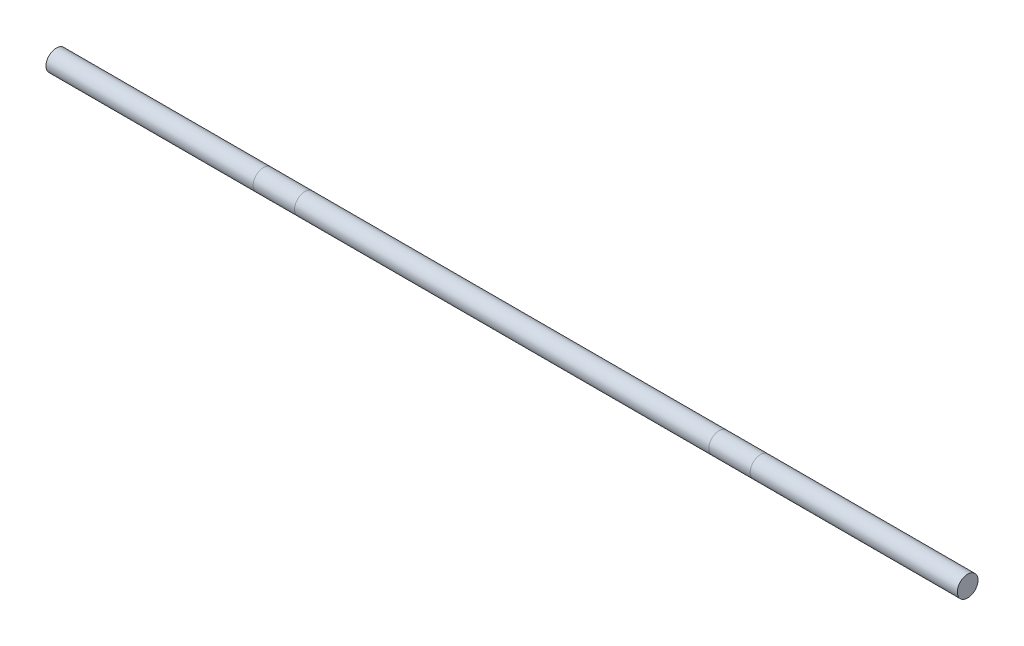
ISO-10303-21;
HEADER;
FILE_DESCRIPTION(('STEP AP214'),'2;1');
FILE_NAME('part.step','',(''),(''),'','','');
FILE_SCHEMA(('AUTOMOTIVE_DESIGN { 1 0 10303 214 1 1 1 1 }'));
ENDSEC;
DATA;
#1=APPLICATION_CONTEXT('core data for automotive mechanical design processes');
#2=APPLICATION_PROTOCOL_DEFINITION('international standard','automotive_design',2000,#1);
#3=PRODUCT_CONTEXT('',#1,'mechanical');
#4=PRODUCT('Part','Part','',(#3));
#5=PRODUCT_RELATED_PRODUCT_CATEGORY('part','',(#4));
#6=PRODUCT_DEFINITION_FORMATION('','',#4);
#7=PRODUCT_DEFINITION_CONTEXT('part definition',#1,'design');
#8=PRODUCT_DEFINITION('design','',#6,#7);
#9=PRODUCT_DEFINITION_SHAPE('','',#8);
#10=(LENGTH_UNIT() NAMED_UNIT(*) SI_UNIT(.MILLI.,.METRE.));
#11=(NAMED_UNIT(*) PLANE_ANGLE_UNIT() SI_UNIT($,.RADIAN.));
#12=(NAMED_UNIT(*) SI_UNIT($,.STERADIAN.) SOLID_ANGLE_UNIT());
#13=UNCERTAINTY_MEASURE_WITH_UNIT(LENGTH_MEASURE(1.E-05),#10,'distance_accuracy_value','');
#14=(GEOMETRIC_REPRESENTATION_CONTEXT(3) GLOBAL_UNCERTAINTY_ASSIGNED_CONTEXT((#13)) GLOBAL_UNIT_ASSIGNED_CONTEXT((#10,
#11,#12)) REPRESENTATION_CONTEXT('',''));
#15=CARTESIAN_POINT('',(0.,0.,0.));
#16=DIRECTION('',(0.,0.,1.));
#17=DIRECTION('',(1.,0.,0.));
#18=AXIS2_PLACEMENT_3D('',#15,#16,#17);
#19=CARTESIAN_POINT('',(1100.,0.,0.));
#20=DIRECTION('',(-1.,0.,0.));
#21=DIRECTION('',(0.,0.,1.));
#22=AXIS2_PLACEMENT_3D('',#19,#20,#21);
#23=CYLINDRICAL_SURFACE('',#22,25.);
#24=CARTESIAN_POINT('',(-500.,0.,0.));
#25=DIRECTION('',(-1.,0.,0.));
#26=DIRECTION('',(0.,-1.,0.));
#27=AXIS2_PLACEMENT_3D('',#24,#25,#26);
#28=CIRCLE('',#27,25.);
#29=CARTESIAN_POINT('',(-500.,-25.,0.));
#30=VERTEX_POINT('',#29);
#31=EDGE_CURVE('E63',#30,#30,#28,.T.);
#32=ORIENTED_EDGE('',*,*,#31,.F.);
#33=EDGE_LOOP('',(#32));
#34=FACE_BOUND('',#33,.T.);
#35=CARTESIAN_POINT('',(500.,0.,0.));
#36=DIRECTION('',(1.,0.,0.));
#37=DIRECTION('',(0.,1.,0.));
#38=AXIS2_PLACEMENT_3D('',#35,#36,#37);
#39=CIRCLE('',#38,25.);
#40=CARTESIAN_POINT('',(500.,25.,0.));
#41=VERTEX_POINT('',#40);
#42=EDGE_CURVE('E10',#41,#41,#39,.T.);
#43=ORIENTED_EDGE('',*,*,#42,.F.);
#44=EDGE_LOOP('',(#43));
#45=FACE_BOUND('',#44,.T.);
#46=ADVANCED_FACE('F40',(#34,#45),#23,.T.);
#47=CARTESIAN_POINT('',(1100.,0.,0.));
#48=DIRECTION('',(1.,0.,0.));
#49=DIRECTION('',(0.,0.,-1.));
#50=AXIS2_PLACEMENT_3D('',#47,#48,#49);
#51=CIRCLE('',#50,25.);
#52=CARTESIAN_POINT('',(1100.,0.,-25.));
#53=VERTEX_POINT('',#52);
#54=EDGE_CURVE('E68',#53,#53,#51,.T.);
#55=ORIENTED_EDGE('',*,*,#54,.F.);
#56=EDGE_LOOP('',(#55));
#57=FACE_BOUND('',#56,.T.);
#58=CARTESIAN_POINT('',(600.,0.,0.));
#59=DIRECTION('',(-1.,0.,0.));
#60=DIRECTION('',(0.,-1.,0.));
#61=AXIS2_PLACEMENT_3D('',#58,#59,#60);
#62=CIRCLE('',#61,25.);
#63=CARTESIAN_POINT('',(600.,-25.,0.));
#64=VERTEX_POINT('',#63);
#65=EDGE_CURVE('E48',#64,#64,#62,.T.);
#66=ORIENTED_EDGE('',*,*,#65,.F.);
#67=EDGE_LOOP('',(#66));
#68=FACE_BOUND('',#67,.T.);
#69=ADVANCED_FACE('F77',(#57,#68),#23,.T.);
#70=CARTESIAN_POINT('',(-1100.,0.,0.));
#71=DIRECTION('',(1.,0.,0.));
#72=DIRECTION('',(0.,0.,-1.));
#73=AXIS2_PLACEMENT_3D('',#70,#71,#72);
#74=CIRCLE('',#73,25.);
#75=CARTESIAN_POINT('',(-1100.,0.,-25.));
#76=VERTEX_POINT('',#75);
#77=EDGE_CURVE('E69',#76,#76,#74,.T.);
#78=ORIENTED_EDGE('',*,*,#77,.T.);
#79=EDGE_LOOP('',(#78));
#80=FACE_BOUND('',#79,.T.);
#81=CARTESIAN_POINT('',(-600.,0.,0.));
#82=DIRECTION('',(1.,0.,0.));
#83=DIRECTION('',(0.,1.,0.));
#84=AXIS2_PLACEMENT_3D('',#81,#82,#83);
#85=CIRCLE('',#84,25.);
#86=CARTESIAN_POINT('',(-600.,25.,0.));
#87=VERTEX_POINT('',#86);
#88=EDGE_CURVE('E56',#87,#87,#85,.T.);
#89=ORIENTED_EDGE('',*,*,#88,.F.);
#90=EDGE_LOOP('',(#89));
#91=FACE_BOUND('',#90,.T.);
#92=ADVANCED_FACE('F80',(#80,#91),#23,.T.);
#93=ORIENTED_EDGE('',*,*,#42,.T.);
#94=EDGE_LOOP('',(#93));
#95=FACE_BOUND('',#94,.T.);
#96=ORIENTED_EDGE('',*,*,#65,.T.);
#97=EDGE_LOOP('',(#96));
#98=FACE_BOUND('',#97,.T.);
#99=ADVANCED_FACE('F85',(#95,#98),#23,.T.);
#100=ORIENTED_EDGE('',*,*,#88,.T.);
#101=EDGE_LOOP('',(#100));
#102=FACE_BOUND('',#101,.T.);
#103=ORIENTED_EDGE('',*,*,#31,.T.);
#104=EDGE_LOOP('',(#103));
#105=FACE_BOUND('',#104,.T.);
#106=ADVANCED_FACE('F42',(#102,#105),#23,.T.);
#107=CARTESIAN_POINT('',(1100.,0.,0.));
#108=DIRECTION('',(1.,0.,0.));
#109=DIRECTION('',(0.,0.,-1.));
#110=AXIS2_PLACEMENT_3D('',#107,#108,#109);
#111=PLANE('',#110);
#112=ORIENTED_EDGE('',*,*,#54,.T.);
#113=EDGE_LOOP('',(#112));
#114=FACE_BOUND('',#113,.T.);
#115=ADVANCED_FACE('F75',(#114),#111,.T.);
#116=CARTESIAN_POINT('',(-1100.,0.,0.));
#117=DIRECTION('',(1.,0.,0.));
#118=DIRECTION('',(0.,0.,-1.));
#119=AXIS2_PLACEMENT_3D('',#116,#117,#118);
#120=PLANE('',#119);
#121=ORIENTED_EDGE('',*,*,#77,.F.);
#122=EDGE_LOOP('',(#121));
#123=FACE_BOUND('',#122,.T.);
#124=ADVANCED_FACE('F98',(#123),#120,.F.);
#125=CLOSED_SHELL('',(#46,#69,#92,#99,#106,#115,#124));
#126=MANIFOLD_SOLID_BREP('B2',#125);
#127=ADVANCED_BREP_SHAPE_REPRESENTATION('',(#18,#126),#14);
#128=SHAPE_DEFINITION_REPRESENTATION(#9,#127);
ENDSEC;
END-ISO-10303-21;
